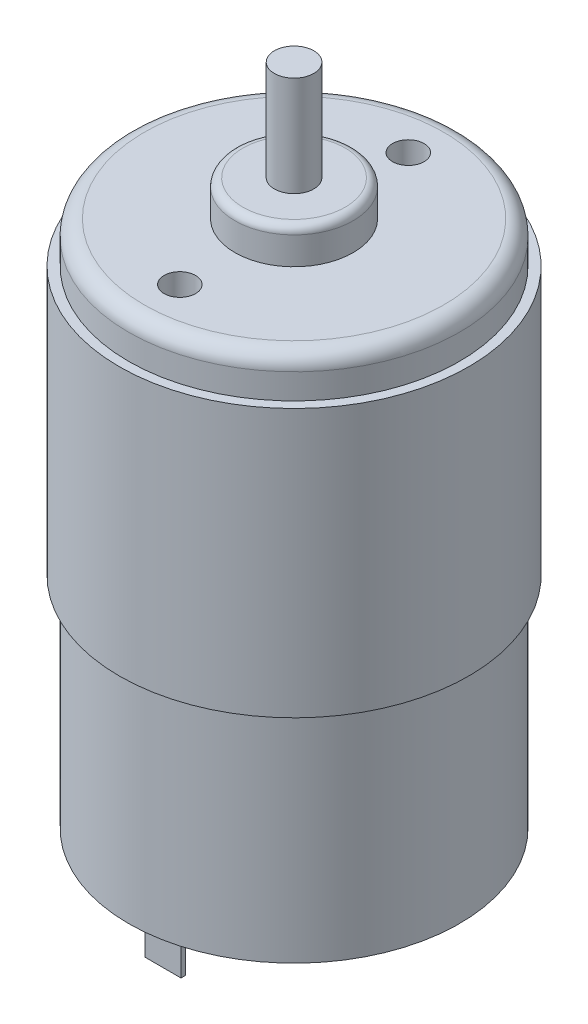
ISO-10303-21;
HEADER;
FILE_DESCRIPTION(('STEP AP214'),'2;1');
FILE_NAME('part.step','',(''),(''),'','','');
FILE_SCHEMA(('AUTOMOTIVE_DESIGN { 1 0 10303 214 1 1 1 1 }'));
ENDSEC;
DATA;
#1=APPLICATION_CONTEXT('core data for automotive mechanical design processes');
#2=APPLICATION_PROTOCOL_DEFINITION('international standard','automotive_design',2000,#1);
#3=PRODUCT_CONTEXT('',#1,'mechanical');
#4=PRODUCT('Part','Part','',(#3));
#5=PRODUCT_RELATED_PRODUCT_CATEGORY('part','',(#4));
#6=PRODUCT_DEFINITION_FORMATION('','',#4);
#7=PRODUCT_DEFINITION_CONTEXT('part definition',#1,'design');
#8=PRODUCT_DEFINITION('design','',#6,#7);
#9=PRODUCT_DEFINITION_SHAPE('','',#8);
#10=(LENGTH_UNIT() NAMED_UNIT(*) SI_UNIT(.MILLI.,.METRE.));
#11=(NAMED_UNIT(*) PLANE_ANGLE_UNIT() SI_UNIT($,.RADIAN.));
#12=(NAMED_UNIT(*) SI_UNIT($,.STERADIAN.) SOLID_ANGLE_UNIT());
#13=UNCERTAINTY_MEASURE_WITH_UNIT(LENGTH_MEASURE(1.E-05),#10,'distance_accuracy_value','');
#14=(GEOMETRIC_REPRESENTATION_CONTEXT(3) GLOBAL_UNCERTAINTY_ASSIGNED_CONTEXT((#13)) GLOBAL_UNIT_ASSIGNED_CONTEXT((#10,
#11,#12)) REPRESENTATION_CONTEXT('',''));
#15=CARTESIAN_POINT('',(0.,0.,0.));
#16=DIRECTION('',(0.,0.,1.));
#17=DIRECTION('',(1.,0.,0.));
#18=AXIS2_PLACEMENT_3D('',#15,#16,#17);
#19=CARTESIAN_POINT('',(0.,71.5,0.));
#20=DIRECTION('',(0.,1.,0.));
#21=DIRECTION('',(0.,0.,1.));
#22=AXIS2_PLACEMENT_3D('',#19,#20,#21);
#23=PLANE('',#22);
#24=CARTESIAN_POINT('',(0.,71.5,0.));
#25=DIRECTION('',(0.,1.,0.));
#26=DIRECTION('',(0.,0.,1.));
#27=AXIS2_PLACEMENT_3D('',#24,#25,#26);
#28=CIRCLE('',#27,6.5);
#29=CARTESIAN_POINT('',(0.,71.5,6.5));
#30=VERTEX_POINT('',#29);
#31=EDGE_CURVE('E188',#30,#30,#28,.T.);
#32=ORIENTED_EDGE('',*,*,#31,.T.);
#33=EDGE_LOOP('',(#32));
#34=FACE_BOUND('',#33,.T.);
#35=CARTESIAN_POINT('',(0.,71.5,0.));
#36=DIRECTION('',(0.,1.,0.));
#37=DIRECTION('',(0.,0.,1.));
#38=AXIS2_PLACEMENT_3D('',#35,#36,#37);
#39=CIRCLE('',#38,2.5);
#40=CARTESIAN_POINT('',(0.,71.5,2.5));
#41=VERTEX_POINT('',#40);
#42=EDGE_CURVE('E168',#41,#41,#39,.T.);
#43=ORIENTED_EDGE('',*,*,#42,.F.);
#44=EDGE_LOOP('',(#43));
#45=FACE_BOUND('',#44,.T.);
#46=ADVANCED_FACE('F34',(#34,#45),#23,.T.);
#47=CARTESIAN_POINT('',(0.,67.,0.));
#48=DIRECTION('',(0.,1.,0.));
#49=DIRECTION('',(0.,0.,1.));
#50=AXIS2_PLACEMENT_3D('',#47,#48,#49);
#51=PLANE('',#50);
#52=CARTESIAN_POINT('',(0.,67.,14.5));
#53=DIRECTION('',(0.,1.,0.));
#54=DIRECTION('',(0.,0.,1.));
#55=AXIS2_PLACEMENT_3D('',#52,#53,#54);
#56=CIRCLE('',#55,2.);
#57=CARTESIAN_POINT('',(0.,67.,16.5));
#58=VERTEX_POINT('',#57);
#59=EDGE_CURVE('E158',#58,#58,#56,.T.);
#60=ORIENTED_EDGE('',*,*,#59,.F.);
#61=EDGE_LOOP('',(#60));
#62=FACE_BOUND('',#61,.T.);
#63=CARTESIAN_POINT('',(0.,67.,-14.5));
#64=DIRECTION('',(0.,1.,0.));
#65=DIRECTION('',(0.,0.,1.));
#66=AXIS2_PLACEMENT_3D('',#63,#64,#65);
#67=CIRCLE('',#66,2.);
#68=CARTESIAN_POINT('',(0.,67.,-12.5));
#69=VERTEX_POINT('',#68);
#70=EDGE_CURVE('E162',#69,#69,#67,.T.);
#71=ORIENTED_EDGE('',*,*,#70,.F.);
#72=EDGE_LOOP('',(#71));
#73=FACE_BOUND('',#72,.T.);
#74=CARTESIAN_POINT('',(0.,67.,0.));
#75=DIRECTION('',(0.,1.,0.));
#76=DIRECTION('',(0.,0.,1.));
#77=AXIS2_PLACEMENT_3D('',#74,#75,#76);
#78=CIRCLE('',#77,19.);
#79=CARTESIAN_POINT('',(0.,67.,19.));
#80=VERTEX_POINT('',#79);
#81=EDGE_CURVE('E182',#80,#80,#78,.T.);
#82=ORIENTED_EDGE('',*,*,#81,.T.);
#83=EDGE_LOOP('',(#82));
#84=FACE_BOUND('',#83,.T.);
#85=CARTESIAN_POINT('',(0.,67.,0.));
#86=DIRECTION('',(0.,1.,0.));
#87=DIRECTION('',(0.,0.,1.));
#88=AXIS2_PLACEMENT_3D('',#85,#86,#87);
#89=CIRCLE('',#88,7.5);
#90=CARTESIAN_POINT('',(0.,67.,7.5));
#91=VERTEX_POINT('',#90);
#92=EDGE_CURVE('E174',#91,#91,#89,.T.);
#93=ORIENTED_EDGE('',*,*,#92,.F.);
#94=EDGE_LOOP('',(#93));
#95=FACE_BOUND('',#94,.T.);
#96=ADVANCED_FACE('F214',(#62,#73,#84,#95),#51,.T.);
#97=CARTESIAN_POINT('',(0.,67.,0.));
#98=DIRECTION('',(0.,-1.,0.));
#99=DIRECTION('',(0.,0.,-1.));
#100=AXIS2_PLACEMENT_3D('',#97,#98,#99);
#101=CYLINDRICAL_SURFACE('',#100,21.);
#102=CARTESIAN_POINT('',(0.,61.8,0.));
#103=DIRECTION('',(0.,1.,0.));
#104=DIRECTION('',(0.,0.,1.));
#105=AXIS2_PLACEMENT_3D('',#102,#103,#104);
#106=CIRCLE('',#105,21.);
#107=CARTESIAN_POINT('',(0.,61.8,21.));
#108=VERTEX_POINT('',#107);
#109=EDGE_CURVE('E339',#108,#108,#106,.T.);
#110=ORIENTED_EDGE('',*,*,#109,.T.);
#111=EDGE_LOOP('',(#110));
#112=FACE_BOUND('',#111,.T.);
#113=CARTESIAN_POINT('',(0.,65.,0.));
#114=DIRECTION('',(0.,1.,0.));
#115=DIRECTION('',(0.,0.,1.));
#116=AXIS2_PLACEMENT_3D('',#113,#114,#115);
#117=CIRCLE('',#116,21.);
#118=CARTESIAN_POINT('',(0.,65.,21.));
#119=VERTEX_POINT('',#118);
#120=EDGE_CURVE('E185',#119,#119,#117,.F.);
#121=ORIENTED_EDGE('',*,*,#120,.T.);
#122=EDGE_LOOP('',(#121));
#123=FACE_BOUND('',#122,.T.);
#124=ADVANCED_FACE('F208',(#112,#123),#101,.T.);
#125=CARTESIAN_POINT('',(0.,71.5,0.));
#126=DIRECTION('',(0.,-1.,0.));
#127=DIRECTION('',(0.,0.,-1.));
#128=AXIS2_PLACEMENT_3D('',#125,#126,#127);
#129=CYLINDRICAL_SURFACE('',#128,7.5);
#130=CARTESIAN_POINT('',(0.,70.5,0.));
#131=DIRECTION('',(0.,1.,0.));
#132=DIRECTION('',(0.,0.,1.));
#133=AXIS2_PLACEMENT_3D('',#130,#131,#132);
#134=CIRCLE('',#133,7.5);
#135=CARTESIAN_POINT('',(0.,70.5,7.5));
#136=VERTEX_POINT('',#135);
#137=EDGE_CURVE('E191',#136,#136,#134,.F.);
#138=ORIENTED_EDGE('',*,*,#137,.T.);
#139=EDGE_LOOP('',(#138));
#140=FACE_BOUND('',#139,.T.);
#141=ORIENTED_EDGE('',*,*,#92,.T.);
#142=EDGE_LOOP('',(#141));
#143=FACE_BOUND('',#142,.T.);
#144=ADVANCED_FACE('F226',(#140,#143),#129,.T.);
#145=CARTESIAN_POINT('',(0.,84.2,0.));
#146=DIRECTION('',(0.,-1.,0.));
#147=DIRECTION('',(0.,0.,-1.));
#148=AXIS2_PLACEMENT_3D('',#145,#146,#147);
#149=CYLINDRICAL_SURFACE('',#148,2.5);
#150=CARTESIAN_POINT('',(0.,84.2,0.));
#151=DIRECTION('',(0.,1.,0.));
#152=DIRECTION('',(0.,0.,1.));
#153=AXIS2_PLACEMENT_3D('',#150,#151,#152);
#154=CIRCLE('',#153,2.5);
#155=CARTESIAN_POINT('',(0.,84.2,2.5));
#156=VERTEX_POINT('',#155);
#157=EDGE_CURVE('E171',#156,#156,#154,.T.);
#158=ORIENTED_EDGE('',*,*,#157,.F.);
#159=EDGE_LOOP('',(#158));
#160=FACE_BOUND('',#159,.T.);
#161=ORIENTED_EDGE('',*,*,#42,.T.);
#162=EDGE_LOOP('',(#161));
#163=FACE_BOUND('',#162,.T.);
#164=ADVANCED_FACE('F224',(#160,#163),#149,.T.);
#165=CARTESIAN_POINT('',(0.,84.2,0.));
#166=DIRECTION('',(0.,1.,0.));
#167=DIRECTION('',(0.,0.,1.));
#168=AXIS2_PLACEMENT_3D('',#165,#166,#167);
#169=PLANE('',#168);
#170=ORIENTED_EDGE('',*,*,#157,.T.);
#171=EDGE_LOOP('',(#170));
#172=FACE_BOUND('',#171,.T.);
#173=ADVANCED_FACE('F233',(#172),#169,.T.);
#174=CARTESIAN_POINT('',(0.,65.,0.));
#175=DIRECTION('',(0.,1.,0.));
#176=DIRECTION('',(0.,0.,1.));
#177=AXIS2_PLACEMENT_3D('',#174,#175,#176);
#178=TOROIDAL_SURFACE('',#177,19.,2.);
#179=ORIENTED_EDGE('',*,*,#120,.F.);
#180=EDGE_LOOP('',(#179));
#181=FACE_BOUND('',#180,.T.);
#182=ORIENTED_EDGE('',*,*,#81,.F.);
#183=EDGE_LOOP('',(#182));
#184=FACE_BOUND('',#183,.T.);
#185=ADVANCED_FACE('F244',(#181,#184),#178,.T.);
#186=CARTESIAN_POINT('',(0.,70.5,0.));
#187=DIRECTION('',(0.,1.,0.));
#188=DIRECTION('',(0.,0.,1.));
#189=AXIS2_PLACEMENT_3D('',#186,#187,#188);
#190=TOROIDAL_SURFACE('',#189,6.5,1.);
#191=ORIENTED_EDGE('',*,*,#137,.F.);
#192=EDGE_LOOP('',(#191));
#193=FACE_BOUND('',#192,.T.);
#194=ORIENTED_EDGE('',*,*,#31,.F.);
#195=EDGE_LOOP('',(#194));
#196=FACE_BOUND('',#195,.T.);
#197=ADVANCED_FACE('F36',(#193,#196),#190,.T.);
#198=CARTESIAN_POINT('',(0.,62.,-14.5));
#199=DIRECTION('',(0.,1.,0.));
#200=DIRECTION('',(0.,0.,1.));
#201=AXIS2_PLACEMENT_3D('',#198,#199,#200);
#202=CYLINDRICAL_SURFACE('',#201,2.);
#203=CARTESIAN_POINT('',(0.,62.,-14.5));
#204=DIRECTION('',(0.,1.,0.));
#205=DIRECTION('',(0.,0.,1.));
#206=AXIS2_PLACEMENT_3D('',#203,#204,#205);
#207=CIRCLE('',#206,2.);
#208=CARTESIAN_POINT('',(0.,62.,-12.5));
#209=VERTEX_POINT('',#208);
#210=EDGE_CURVE('E165',#209,#209,#207,.T.);
#211=ORIENTED_EDGE('',*,*,#210,.F.);
#212=EDGE_LOOP('',(#211));
#213=FACE_BOUND('',#212,.T.);
#214=ORIENTED_EDGE('',*,*,#70,.T.);
#215=EDGE_LOOP('',(#214));
#216=FACE_BOUND('',#215,.T.);
#217=ADVANCED_FACE('F243',(#213,#216),#202,.F.);
#218=CARTESIAN_POINT('',(0.,62.,-14.5));
#219=DIRECTION('',(0.,1.,0.));
#220=DIRECTION('',(0.,0.,1.));
#221=AXIS2_PLACEMENT_3D('',#218,#219,#220);
#222=PLANE('',#221);
#223=ORIENTED_EDGE('',*,*,#210,.T.);
#224=EDGE_LOOP('',(#223));
#225=FACE_BOUND('',#224,.T.);
#226=ADVANCED_FACE('F250',(#225),#222,.T.);
#227=CARTESIAN_POINT('',(0.,62.,14.5));
#228=DIRECTION('',(0.,1.,0.));
#229=DIRECTION('',(0.,0.,1.));
#230=AXIS2_PLACEMENT_3D('',#227,#228,#229);
#231=CYLINDRICAL_SURFACE('',#230,2.);
#232=CARTESIAN_POINT('',(0.,62.,14.5));
#233=DIRECTION('',(0.,1.,0.));
#234=DIRECTION('',(0.,0.,1.));
#235=AXIS2_PLACEMENT_3D('',#232,#233,#234);
#236=CIRCLE('',#235,2.);
#237=CARTESIAN_POINT('',(0.,62.,16.5));
#238=VERTEX_POINT('',#237);
#239=EDGE_CURVE('E159',#238,#238,#236,.T.);
#240=ORIENTED_EDGE('',*,*,#239,.F.);
#241=EDGE_LOOP('',(#240));
#242=FACE_BOUND('',#241,.T.);
#243=ORIENTED_EDGE('',*,*,#59,.T.);
#244=EDGE_LOOP('',(#243));
#245=FACE_BOUND('',#244,.T.);
#246=ADVANCED_FACE('F268',(#242,#245),#231,.F.);
#247=CARTESIAN_POINT('',(0.,62.,14.5));
#248=DIRECTION('',(0.,1.,0.));
#249=DIRECTION('',(0.,0.,1.));
#250=AXIS2_PLACEMENT_3D('',#247,#248,#249);
#251=PLANE('',#250);
#252=ORIENTED_EDGE('',*,*,#239,.T.);
#253=EDGE_LOOP('',(#252));
#254=FACE_BOUND('',#253,.T.);
#255=ADVANCED_FACE('F272',(#254),#251,.T.);
#256=CARTESIAN_POINT('',(0.,27.8,0.));
#257=DIRECTION('',(0.,1.,0.));
#258=DIRECTION('',(0.,0.,1.));
#259=AXIS2_PLACEMENT_3D('',#256,#257,#258);
#260=CYLINDRICAL_SURFACE('',#259,22.175);
#261=CARTESIAN_POINT('',(0.,27.8,0.));
#262=DIRECTION('',(0.,1.,0.));
#263=DIRECTION('',(0.,0.,1.));
#264=AXIS2_PLACEMENT_3D('',#261,#262,#263);
#265=CIRCLE('',#264,22.175);
#266=CARTESIAN_POINT('',(0.,27.8,22.175));
#267=VERTEX_POINT('',#266);
#268=EDGE_CURVE('E332',#267,#267,#265,.T.);
#269=ORIENTED_EDGE('',*,*,#268,.T.);
#270=EDGE_LOOP('',(#269));
#271=FACE_BOUND('',#270,.T.);
#272=CARTESIAN_POINT('',(0.,61.8,0.));
#273=DIRECTION('',(0.,1.,0.));
#274=DIRECTION('',(0.,0.,1.));
#275=AXIS2_PLACEMENT_3D('',#272,#273,#274);
#276=CIRCLE('',#275,22.175);
#277=CARTESIAN_POINT('',(0.,61.8,22.175));
#278=VERTEX_POINT('',#277);
#279=EDGE_CURVE('E334',#278,#278,#276,.T.);
#280=ORIENTED_EDGE('',*,*,#279,.F.);
#281=EDGE_LOOP('',(#280));
#282=FACE_BOUND('',#281,.T.);
#283=ADVANCED_FACE('F276',(#271,#282),#260,.T.);
#284=CARTESIAN_POINT('',(0.,27.8,0.));
#285=DIRECTION('',(0.,1.,0.));
#286=DIRECTION('',(0.,0.,1.));
#287=AXIS2_PLACEMENT_3D('',#284,#285,#286);
#288=PLANE('',#287);
#289=CARTESIAN_POINT('',(0.,27.8,0.));
#290=DIRECTION('',(0.,1.,0.));
#291=DIRECTION('',(0.,0.,1.));
#292=AXIS2_PLACEMENT_3D('',#289,#290,#291);
#293=CIRCLE('',#292,21.);
#294=CARTESIAN_POINT('',(0.,27.8,21.));
#295=VERTEX_POINT('',#294);
#296=EDGE_CURVE('E11',#295,#295,#293,.T.);
#297=ORIENTED_EDGE('',*,*,#296,.T.);
#298=EDGE_LOOP('',(#297));
#299=FACE_BOUND('',#298,.T.);
#300=ORIENTED_EDGE('',*,*,#268,.F.);
#301=EDGE_LOOP('',(#300));
#302=FACE_BOUND('',#301,.T.);
#303=ADVANCED_FACE('F319',(#299,#302),#288,.F.);
#304=CARTESIAN_POINT('',(0.,61.8,0.));
#305=DIRECTION('',(0.,1.,0.));
#306=DIRECTION('',(0.,0.,1.));
#307=AXIS2_PLACEMENT_3D('',#304,#305,#306);
#308=PLANE('',#307);
#309=ORIENTED_EDGE('',*,*,#109,.F.);
#310=EDGE_LOOP('',(#309));
#311=FACE_BOUND('',#310,.T.);
#312=ORIENTED_EDGE('',*,*,#279,.T.);
#313=EDGE_LOOP('',(#312));
#314=FACE_BOUND('',#313,.T.);
#315=ADVANCED_FACE('F315',(#311,#314),#308,.T.);
#316=CARTESIAN_POINT('',(0.,-7.,0.));
#317=DIRECTION('',(0.,-1.,0.));
#318=DIRECTION('',(0.,0.,-1.));
#319=AXIS2_PLACEMENT_3D('',#316,#317,#318);
#320=PLANE('',#319);
#321=CARTESIAN_POINT('',(0.,-7.,0.));
#322=DIRECTION('',(0.,-1.,0.));
#323=DIRECTION('',(0.,0.,-1.));
#324=AXIS2_PLACEMENT_3D('',#321,#322,#323);
#325=CIRCLE('',#324,7.6);
#326=CARTESIAN_POINT('',(0.,-7.,-7.6));
#327=VERTEX_POINT('',#326);
#328=EDGE_CURVE('E333',#327,#327,#325,.T.);
#329=ORIENTED_EDGE('',*,*,#328,.T.);
#330=EDGE_LOOP('',(#329));
#331=FACE_BOUND('',#330,.T.);
#332=ADVANCED_FACE('F296',(#331),#320,.T.);
#333=CARTESIAN_POINT('',(2.29999999999999,-7.,16.65));
#334=DIRECTION('',(0.,1.,0.));
#335=DIRECTION('',(0.,0.,1.));
#336=AXIS2_PLACEMENT_3D('',#333,#334,#335);
#337=PLANE('',#336);
#338=DIRECTION('',(-1.,0.,0.));
#339=VECTOR('',#338,1.);
#340=CARTESIAN_POINT('',(-2.30000000000001,-7.,16.65));
#341=LINE('',#340,#339);
#342=CARTESIAN_POINT('',(2.29999999999999,-7.,16.65));
#343=VERTEX_POINT('',#342);
#344=CARTESIAN_POINT('',(-2.30000000000001,-7.,16.65));
#345=VERTEX_POINT('',#344);
#346=EDGE_CURVE('E129',#343,#345,#341,.T.);
#347=ORIENTED_EDGE('',*,*,#346,.T.);
#348=DIRECTION('',(0.,0.,-1.));
#349=VECTOR('',#348,1.);
#350=CARTESIAN_POINT('',(-2.30000000000001,-7.,16.65));
#351=LINE('',#350,#349);
#352=CARTESIAN_POINT('',(-2.30000000000001,-7.,16.05));
#353=VERTEX_POINT('',#352);
#354=EDGE_CURVE('E132',#345,#353,#351,.T.);
#355=ORIENTED_EDGE('',*,*,#354,.T.);
#356=DIRECTION('',(1.,0.,0.));
#357=VECTOR('',#356,1.);
#358=CARTESIAN_POINT('',(-2.30000000000001,-7.,16.05));
#359=LINE('',#358,#357);
#360=CARTESIAN_POINT('',(2.29999999999999,-7.,16.05));
#361=VERTEX_POINT('',#360);
#362=EDGE_CURVE('E135',#353,#361,#359,.T.);
#363=ORIENTED_EDGE('',*,*,#362,.T.);
#364=DIRECTION('',(0.,0.,1.));
#365=VECTOR('',#364,1.);
#366=CARTESIAN_POINT('',(2.29999999999999,-7.,16.65));
#367=LINE('',#366,#365);
#368=EDGE_CURVE('E137',#361,#343,#367,.T.);
#369=ORIENTED_EDGE('',*,*,#368,.T.);
#370=EDGE_LOOP('',(#347,#355,#363,#369));
#371=FACE_BOUND('',#370,.T.);
#372=ADVANCED_FACE('F294',(#371),#337,.F.);
#373=CARTESIAN_POINT('',(2.3,-7.,-16.05));
#374=DIRECTION('',(0.,-1.,0.));
#375=DIRECTION('',(0.,0.,-1.));
#376=AXIS2_PLACEMENT_3D('',#373,#374,#375);
#377=PLANE('',#376);
#378=DIRECTION('',(0.,0.,1.));
#379=VECTOR('',#378,1.);
#380=CARTESIAN_POINT('',(2.3,-7.,-16.65));
#381=LINE('',#380,#379);
#382=CARTESIAN_POINT('',(2.3,-7.,-16.65));
#383=VERTEX_POINT('',#382);
#384=CARTESIAN_POINT('',(2.3,-7.,-16.05));
#385=VERTEX_POINT('',#384);
#386=EDGE_CURVE('E107',#383,#385,#381,.T.);
#387=ORIENTED_EDGE('',*,*,#386,.T.);
#388=DIRECTION('',(-1.,0.,0.));
#389=VECTOR('',#388,1.);
#390=CARTESIAN_POINT('',(2.3,-7.,-16.05));
#391=LINE('',#390,#389);
#392=CARTESIAN_POINT('',(-2.30000000000002,-7.,-16.05));
#393=VERTEX_POINT('',#392);
#394=EDGE_CURVE('E96',#385,#393,#391,.T.);
#395=ORIENTED_EDGE('',*,*,#394,.T.);
#396=DIRECTION('',(0.,0.,-1.));
#397=VECTOR('',#396,1.);
#398=CARTESIAN_POINT('',(-2.30000000000002,-7.,-16.65));
#399=LINE('',#398,#397);
#400=CARTESIAN_POINT('',(-2.30000000000002,-7.,-16.65));
#401=VERTEX_POINT('',#400);
#402=EDGE_CURVE('E106',#393,#401,#399,.T.);
#403=ORIENTED_EDGE('',*,*,#402,.T.);
#404=DIRECTION('',(1.,0.,0.));
#405=VECTOR('',#404,1.);
#406=CARTESIAN_POINT('',(2.3,-7.,-16.65));
#407=LINE('',#406,#405);
#408=EDGE_CURVE('E112',#401,#383,#407,.T.);
#409=ORIENTED_EDGE('',*,*,#408,.T.);
#410=EDGE_LOOP('',(#387,#395,#403,#409));
#411=FACE_BOUND('',#410,.T.);
#412=ADVANCED_FACE('F110',(#411),#377,.T.);
#413=CARTESIAN_POINT('',(0.,-7.,0.));
#414=DIRECTION('',(0.,1.,0.));
#415=DIRECTION('',(0.,0.,1.));
#416=AXIS2_PLACEMENT_3D('',#413,#414,#415);
#417=CYLINDRICAL_SURFACE('',#416,7.6);
#418=ORIENTED_EDGE('',*,*,#328,.F.);
#419=EDGE_LOOP('',(#418));
#420=FACE_BOUND('',#419,.T.);
#421=CARTESIAN_POINT('',(0.,0.,0.));
#422=DIRECTION('',(0.,1.,0.));
#423=DIRECTION('',(0.,0.,1.));
#424=AXIS2_PLACEMENT_3D('',#421,#422,#423);
#425=CIRCLE('',#424,7.6);
#426=CARTESIAN_POINT('',(0.,0.,7.6));
#427=VERTEX_POINT('',#426);
#428=EDGE_CURVE('E42',#427,#427,#425,.F.);
#429=ORIENTED_EDGE('',*,*,#428,.T.);
#430=EDGE_LOOP('',(#429));
#431=FACE_BOUND('',#430,.T.);
#432=ADVANCED_FACE('F196',(#420,#431),#417,.T.);
#433=CARTESIAN_POINT('',(-2.30000000000001,-7.,16.65));
#434=DIRECTION('',(1.,0.,0.));
#435=DIRECTION('',(0.,0.,-1.));
#436=AXIS2_PLACEMENT_3D('',#433,#434,#435);
#437=PLANE('',#436);
#438=DIRECTION('',(0.,0.,-1.));
#439=VECTOR('',#438,1.);
#440=CARTESIAN_POINT('',(-2.30000000000001,0.,16.65));
#441=LINE('',#440,#439);
#442=CARTESIAN_POINT('',(-2.30000000000001,0.,16.65));
#443=VERTEX_POINT('',#442);
#444=CARTESIAN_POINT('',(-2.30000000000001,0.,16.05));
#445=VERTEX_POINT('',#444);
#446=EDGE_CURVE('E123',#443,#445,#441,.T.);
#447=ORIENTED_EDGE('',*,*,#446,.T.);
#448=DIRECTION('',(0.,1.,0.));
#449=VECTOR('',#448,1.);
#450=CARTESIAN_POINT('',(-2.30000000000001,-7.,16.05));
#451=LINE('',#450,#449);
#452=EDGE_CURVE('E152',#353,#445,#451,.T.);
#453=ORIENTED_EDGE('',*,*,#452,.F.);
#454=ORIENTED_EDGE('',*,*,#354,.F.);
#455=DIRECTION('',(0.,1.,0.));
#456=VECTOR('',#455,1.);
#457=CARTESIAN_POINT('',(-2.30000000000001,-7.,16.65));
#458=LINE('',#457,#456);
#459=EDGE_CURVE('E155',#345,#443,#458,.T.);
#460=ORIENTED_EDGE('',*,*,#459,.T.);
#461=EDGE_LOOP('',(#447,#453,#454,#460));
#462=FACE_BOUND('',#461,.T.);
#463=ADVANCED_FACE('F283',(#462),#437,.F.);
#464=CARTESIAN_POINT('',(-2.30000000000001,-7.,16.05));
#465=DIRECTION('',(0.,0.,1.));
#466=DIRECTION('',(1.,0.,0.));
#467=AXIS2_PLACEMENT_3D('',#464,#465,#466);
#468=PLANE('',#467);
#469=DIRECTION('',(1.,0.,0.));
#470=VECTOR('',#469,1.);
#471=CARTESIAN_POINT('',(-2.30000000000001,0.,16.05));
#472=LINE('',#471,#470);
#473=CARTESIAN_POINT('',(2.29999999999999,0.,16.05));
#474=VERTEX_POINT('',#473);
#475=EDGE_CURVE('E142',#445,#474,#472,.T.);
#476=ORIENTED_EDGE('',*,*,#475,.T.);
#477=DIRECTION('',(0.,1.,0.));
#478=VECTOR('',#477,1.);
#479=CARTESIAN_POINT('',(2.29999999999999,-7.,16.05));
#480=LINE('',#479,#478);
#481=EDGE_CURVE('E149',#361,#474,#480,.T.);
#482=ORIENTED_EDGE('',*,*,#481,.F.);
#483=ORIENTED_EDGE('',*,*,#362,.F.);
#484=ORIENTED_EDGE('',*,*,#452,.T.);
#485=EDGE_LOOP('',(#476,#482,#483,#484));
#486=FACE_BOUND('',#485,.T.);
#487=ADVANCED_FACE('F286',(#486),#468,.F.);
#488=CARTESIAN_POINT('',(2.29999999999999,-7.,16.65));
#489=DIRECTION('',(-1.,0.,0.));
#490=DIRECTION('',(0.,0.,1.));
#491=AXIS2_PLACEMENT_3D('',#488,#489,#490);
#492=PLANE('',#491);
#493=DIRECTION('',(0.,0.,1.));
#494=VECTOR('',#493,1.);
#495=CARTESIAN_POINT('',(2.29999999999999,0.,16.65));
#496=LINE('',#495,#494);
#497=CARTESIAN_POINT('',(2.29999999999999,0.,16.65));
#498=VERTEX_POINT('',#497);
#499=EDGE_CURVE('E133',#474,#498,#496,.T.);
#500=ORIENTED_EDGE('',*,*,#499,.T.);
#501=DIRECTION('',(0.,1.,0.));
#502=VECTOR('',#501,1.);
#503=CARTESIAN_POINT('',(2.29999999999999,-7.,16.65));
#504=LINE('',#503,#502);
#505=EDGE_CURVE('E138',#343,#498,#504,.T.);
#506=ORIENTED_EDGE('',*,*,#505,.F.);
#507=ORIENTED_EDGE('',*,*,#368,.F.);
#508=ORIENTED_EDGE('',*,*,#481,.T.);
#509=EDGE_LOOP('',(#500,#506,#507,#508));
#510=FACE_BOUND('',#509,.T.);
#511=ADVANCED_FACE('F281',(#510),#492,.F.);
#512=CARTESIAN_POINT('',(-2.30000000000001,-7.,16.65));
#513=DIRECTION('',(0.,0.,-1.));
#514=DIRECTION('',(-1.,0.,0.));
#515=AXIS2_PLACEMENT_3D('',#512,#513,#514);
#516=PLANE('',#515);
#517=DIRECTION('',(-1.,0.,0.));
#518=VECTOR('',#517,1.);
#519=CARTESIAN_POINT('',(-2.30000000000001,0.,16.65));
#520=LINE('',#519,#518);
#521=EDGE_CURVE('E120',#498,#443,#520,.T.);
#522=ORIENTED_EDGE('',*,*,#521,.T.);
#523=ORIENTED_EDGE('',*,*,#459,.F.);
#524=ORIENTED_EDGE('',*,*,#346,.F.);
#525=ORIENTED_EDGE('',*,*,#505,.T.);
#526=EDGE_LOOP('',(#522,#523,#524,#525));
#527=FACE_BOUND('',#526,.T.);
#528=ADVANCED_FACE('F278',(#527),#516,.F.);
#529=CARTESIAN_POINT('',(2.3,-7.,-16.05));
#530=DIRECTION('',(0.,0.,-1.));
#531=DIRECTION('',(-1.,0.,0.));
#532=AXIS2_PLACEMENT_3D('',#529,#530,#531);
#533=PLANE('',#532);
#534=DIRECTION('',(-1.,0.,0.));
#535=VECTOR('',#534,1.);
#536=CARTESIAN_POINT('',(2.3,0.,-16.05));
#537=LINE('',#536,#535);
#538=CARTESIAN_POINT('',(2.3,0.,-16.05));
#539=VERTEX_POINT('',#538);
#540=CARTESIAN_POINT('',(-2.30000000000002,0.,-16.05));
#541=VERTEX_POINT('',#540);
#542=EDGE_CURVE('E49',#539,#541,#537,.T.);
#543=ORIENTED_EDGE('',*,*,#542,.T.);
#544=DIRECTION('',(0.,1.,0.));
#545=VECTOR('',#544,1.);
#546=CARTESIAN_POINT('',(-2.30000000000002,-7.,-16.05));
#547=LINE('',#546,#545);
#548=EDGE_CURVE('E103',#393,#541,#547,.T.);
#549=ORIENTED_EDGE('',*,*,#548,.F.);
#550=ORIENTED_EDGE('',*,*,#394,.F.);
#551=DIRECTION('',(0.,1.,0.));
#552=VECTOR('',#551,1.);
#553=CARTESIAN_POINT('',(2.3,-7.,-16.05));
#554=LINE('',#553,#552);
#555=EDGE_CURVE('E100',#385,#539,#554,.T.);
#556=ORIENTED_EDGE('',*,*,#555,.T.);
#557=EDGE_LOOP('',(#543,#549,#550,#556));
#558=FACE_BOUND('',#557,.T.);
#559=ADVANCED_FACE('F98',(#558),#533,.F.);
#560=CARTESIAN_POINT('',(-2.30000000000002,-7.,-16.65));
#561=DIRECTION('',(1.,0.,0.));
#562=DIRECTION('',(0.,0.,-1.));
#563=AXIS2_PLACEMENT_3D('',#560,#561,#562);
#564=PLANE('',#563);
#565=DIRECTION('',(0.,0.,-1.));
#566=VECTOR('',#565,1.);
#567=CARTESIAN_POINT('',(-2.30000000000002,0.,-16.65));
#568=LINE('',#567,#566);
#569=CARTESIAN_POINT('',(-2.30000000000002,0.,-16.65));
#570=VERTEX_POINT('',#569);
#571=EDGE_CURVE('E54',#541,#570,#568,.T.);
#572=ORIENTED_EDGE('',*,*,#571,.T.);
#573=DIRECTION('',(0.,1.,0.));
#574=VECTOR('',#573,1.);
#575=CARTESIAN_POINT('',(-2.30000000000002,-7.,-16.65));
#576=LINE('',#575,#574);
#577=EDGE_CURVE('E125',#401,#570,#576,.T.);
#578=ORIENTED_EDGE('',*,*,#577,.F.);
#579=ORIENTED_EDGE('',*,*,#402,.F.);
#580=ORIENTED_EDGE('',*,*,#548,.T.);
#581=EDGE_LOOP('',(#572,#578,#579,#580));
#582=FACE_BOUND('',#581,.T.);
#583=ADVANCED_FACE('F301',(#582),#564,.F.);
#584=CARTESIAN_POINT('',(2.3,-7.,-16.65));
#585=DIRECTION('',(0.,0.,1.));
#586=DIRECTION('',(1.,0.,0.));
#587=AXIS2_PLACEMENT_3D('',#584,#585,#586);
#588=PLANE('',#587);
#589=DIRECTION('',(1.,0.,0.));
#590=VECTOR('',#589,1.);
#591=CARTESIAN_POINT('',(2.3,0.,-16.65));
#592=LINE('',#591,#590);
#593=CARTESIAN_POINT('',(2.3,0.,-16.65));
#594=VERTEX_POINT('',#593);
#595=EDGE_CURVE('E116',#570,#594,#592,.T.);
#596=ORIENTED_EDGE('',*,*,#595,.T.);
#597=DIRECTION('',(0.,1.,0.));
#598=VECTOR('',#597,1.);
#599=CARTESIAN_POINT('',(2.3,-7.,-16.65));
#600=LINE('',#599,#598);
#601=EDGE_CURVE('E345',#383,#594,#600,.T.);
#602=ORIENTED_EDGE('',*,*,#601,.F.);
#603=ORIENTED_EDGE('',*,*,#408,.F.);
#604=ORIENTED_EDGE('',*,*,#577,.T.);
#605=EDGE_LOOP('',(#596,#602,#603,#604));
#606=FACE_BOUND('',#605,.T.);
#607=ADVANCED_FACE('F209',(#606),#588,.F.);
#608=CARTESIAN_POINT('',(2.3,-7.,-16.65));
#609=DIRECTION('',(-1.,0.,0.));
#610=DIRECTION('',(0.,0.,1.));
#611=AXIS2_PLACEMENT_3D('',#608,#609,#610);
#612=PLANE('',#611);
#613=DIRECTION('',(0.,0.,1.));
#614=VECTOR('',#613,1.);
#615=CARTESIAN_POINT('',(2.3,0.,-16.65));
#616=LINE('',#615,#614);
#617=EDGE_CURVE('E119',#594,#539,#616,.T.);
#618=ORIENTED_EDGE('',*,*,#617,.T.);
#619=ORIENTED_EDGE('',*,*,#555,.F.);
#620=ORIENTED_EDGE('',*,*,#386,.F.);
#621=ORIENTED_EDGE('',*,*,#601,.T.);
#622=EDGE_LOOP('',(#618,#619,#620,#621));
#623=FACE_BOUND('',#622,.T.);
#624=ADVANCED_FACE('F118',(#623),#612,.F.);
#625=CARTESIAN_POINT('',(0.,0.,0.));
#626=DIRECTION('',(0.,1.,0.));
#627=DIRECTION('',(0.,0.,1.));
#628=AXIS2_PLACEMENT_3D('',#625,#626,#627);
#629=PLANE('',#628);
#630=ORIENTED_EDGE('',*,*,#617,.F.);
#631=ORIENTED_EDGE('',*,*,#595,.F.);
#632=ORIENTED_EDGE('',*,*,#571,.F.);
#633=ORIENTED_EDGE('',*,*,#542,.F.);
#634=EDGE_LOOP('',(#630,#631,#632,#633));
#635=FACE_BOUND('',#634,.T.);
#636=CARTESIAN_POINT('',(0.,0.,0.));
#637=DIRECTION('',(0.,1.,0.));
#638=DIRECTION('',(0.,0.,1.));
#639=AXIS2_PLACEMENT_3D('',#636,#637,#638);
#640=CIRCLE('',#639,21.);
#641=CARTESIAN_POINT('',(0.,0.,21.));
#642=VERTEX_POINT('',#641);
#643=EDGE_CURVE('E179',#642,#642,#640,.T.);
#644=ORIENTED_EDGE('',*,*,#643,.F.);
#645=EDGE_LOOP('',(#644));
#646=FACE_BOUND('',#645,.T.);
#647=ORIENTED_EDGE('',*,*,#521,.F.);
#648=ORIENTED_EDGE('',*,*,#499,.F.);
#649=ORIENTED_EDGE('',*,*,#475,.F.);
#650=ORIENTED_EDGE('',*,*,#446,.F.);
#651=EDGE_LOOP('',(#647,#648,#649,#650));
#652=FACE_BOUND('',#651,.T.);
#653=ORIENTED_EDGE('',*,*,#428,.F.);
#654=EDGE_LOOP('',(#653));
#655=FACE_BOUND('',#654,.T.);
#656=ADVANCED_FACE('F198',(#635,#646,#652,#655),#629,.F.);
#657=ORIENTED_EDGE('',*,*,#643,.T.);
#658=EDGE_LOOP('',(#657));
#659=FACE_BOUND('',#658,.T.);
#660=ORIENTED_EDGE('',*,*,#296,.F.);
#661=EDGE_LOOP('',(#660));
#662=FACE_BOUND('',#661,.T.);
#663=ADVANCED_FACE('F200',(#659,#662),#101,.T.);
#664=CLOSED_SHELL('',(#46,#96,#124,#144,#164,#173,#185,#197,#217,#226,#246,#255,#283,#303,#315,
#332,#372,#412,#432,#463,#487,#511,#528,#559,#583,#607,#624,#656,#663));
#665=MANIFOLD_SOLID_BREP('B2',#664);
#666=ADVANCED_BREP_SHAPE_REPRESENTATION('',(#18,#665),#14);
#667=SHAPE_DEFINITION_REPRESENTATION(#9,#666);
ENDSEC;
END-ISO-10303-21;
